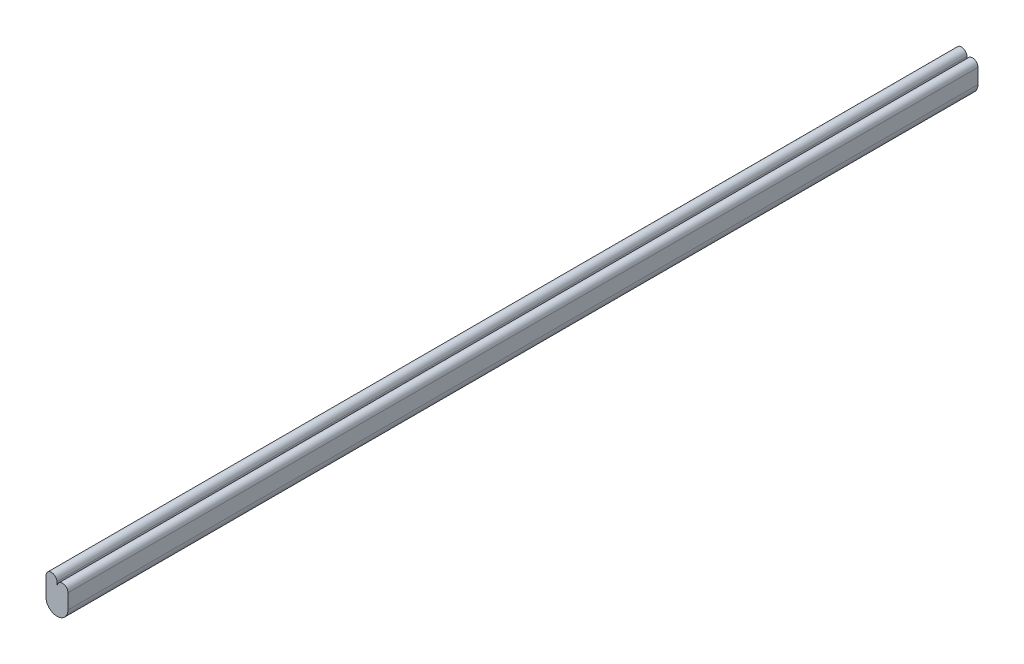
ISO-10303-21;
HEADER;
FILE_DESCRIPTION(('STEP AP214'),'2;1');
FILE_NAME('part.step','',(''),(''),'','','');
FILE_SCHEMA(('AUTOMOTIVE_DESIGN { 1 0 10303 214 1 1 1 1 }'));
ENDSEC;
DATA;
#1=APPLICATION_CONTEXT('core data for automotive mechanical design processes');
#2=APPLICATION_PROTOCOL_DEFINITION('international standard','automotive_design',2000,#1);
#3=PRODUCT_CONTEXT('',#1,'mechanical');
#4=PRODUCT('Part','Part','',(#3));
#5=PRODUCT_RELATED_PRODUCT_CATEGORY('part','',(#4));
#6=PRODUCT_DEFINITION_FORMATION('','',#4);
#7=PRODUCT_DEFINITION_CONTEXT('part definition',#1,'design');
#8=PRODUCT_DEFINITION('design','',#6,#7);
#9=PRODUCT_DEFINITION_SHAPE('','',#8);
#10=(LENGTH_UNIT() NAMED_UNIT(*) SI_UNIT(.MILLI.,.METRE.));
#11=(NAMED_UNIT(*) PLANE_ANGLE_UNIT() SI_UNIT($,.RADIAN.));
#12=(NAMED_UNIT(*) SI_UNIT($,.STERADIAN.) SOLID_ANGLE_UNIT());
#13=UNCERTAINTY_MEASURE_WITH_UNIT(LENGTH_MEASURE(1.E-05),#10,'distance_accuracy_value','');
#14=(GEOMETRIC_REPRESENTATION_CONTEXT(3) GLOBAL_UNCERTAINTY_ASSIGNED_CONTEXT((#13)) GLOBAL_UNIT_ASSIGNED_CONTEXT((#10,
#11,#12)) REPRESENTATION_CONTEXT('',''));
#15=CARTESIAN_POINT('',(0.,0.,0.));
#16=DIRECTION('',(0.,0.,1.));
#17=DIRECTION('',(1.,0.,0.));
#18=AXIS2_PLACEMENT_3D('',#15,#16,#17);
#19=CARTESIAN_POINT('',(-3.5250000148788,12.0249999553636,580.));
#20=DIRECTION('',(0.,0.,-1.));
#21=DIRECTION('',(-1.,0.,0.));
#22=AXIS2_PLACEMENT_3D('',#19,#20,#21);
#23=CYLINDRICAL_SURFACE('',#22,3.4750000148788);
#24=CARTESIAN_POINT('',(-3.5250000148788,12.0249999553636,0.));
#25=DIRECTION('',(0.,0.,1.));
#26=DIRECTION('',(1.,0.,0.));
#27=AXIS2_PLACEMENT_3D('',#24,#25,#26);
#28=CIRCLE('',#27,3.4750000148788);
#29=CARTESIAN_POINT('',(-0.0499999999999997,12.0249999553636,0.));
#30=VERTEX_POINT('',#29);
#31=CARTESIAN_POINT('',(-7.00000002975761,12.0249999553636,0.));
#32=VERTEX_POINT('',#31);
#33=EDGE_CURVE('E133',#30,#32,#28,.T.);
#34=ORIENTED_EDGE('',*,*,#33,.T.);
#35=DIRECTION('',(0.,0.,-1.));
#36=VECTOR('',#35,1.);
#37=CARTESIAN_POINT('',(-7.00000002975761,12.0249999553636,580.));
#38=LINE('',#37,#36);
#39=CARTESIAN_POINT('',(-7.00000002975761,12.0249999553636,580.));
#40=VERTEX_POINT('',#39);
#41=EDGE_CURVE('E11',#40,#32,#38,.T.);
#42=ORIENTED_EDGE('',*,*,#41,.F.);
#43=CARTESIAN_POINT('',(-3.5250000148788,12.0249999553636,580.));
#44=DIRECTION('',(0.,0.,1.));
#45=DIRECTION('',(1.,0.,0.));
#46=AXIS2_PLACEMENT_3D('',#43,#44,#45);
#47=CIRCLE('',#46,3.4750000148788);
#48=CARTESIAN_POINT('',(-0.0499999999999997,12.0249999553636,580.));
#49=VERTEX_POINT('',#48);
#50=EDGE_CURVE('E151',#49,#40,#47,.T.);
#51=ORIENTED_EDGE('',*,*,#50,.F.);
#52=DIRECTION('',(0.,0.,-1.));
#53=VECTOR('',#52,1.);
#54=CARTESIAN_POINT('',(-0.0499999999999997,12.0249999553636,580.));
#55=LINE('',#54,#53);
#56=EDGE_CURVE('E51',#49,#30,#55,.T.);
#57=ORIENTED_EDGE('',*,*,#56,.T.);
#58=EDGE_LOOP('',(#34,#42,#51,#57));
#59=FACE_BOUND('',#58,.T.);
#60=ADVANCED_FACE('F35',(#59),#23,.T.);
#61=CARTESIAN_POINT('',(-7.00000002975761,12.0249999553636,580.));
#62=DIRECTION('',(1.,0.,0.));
#63=DIRECTION('',(0.,0.,-1.));
#64=AXIS2_PLACEMENT_3D('',#61,#62,#63);
#65=PLANE('',#64);
#66=DIRECTION('',(0.,-1.,0.));
#67=VECTOR('',#66,1.);
#68=CARTESIAN_POINT('',(-7.00000002975761,12.0249999553636,0.));
#69=LINE('',#68,#67);
#70=CARTESIAN_POINT('',(-7.00000002975761,0.,0.));
#71=VERTEX_POINT('',#70);
#72=EDGE_CURVE('E135',#32,#71,#69,.T.);
#73=ORIENTED_EDGE('',*,*,#72,.T.);
#74=DIRECTION('',(0.,0.,-1.));
#75=VECTOR('',#74,1.);
#76=CARTESIAN_POINT('',(-7.00000002975761,0.,580.));
#77=LINE('',#76,#75);
#78=CARTESIAN_POINT('',(-7.00000002975761,0.,580.));
#79=VERTEX_POINT('',#78);
#80=EDGE_CURVE('E43',#79,#71,#77,.T.);
#81=ORIENTED_EDGE('',*,*,#80,.F.);
#82=DIRECTION('',(0.,-1.,0.));
#83=VECTOR('',#82,1.);
#84=CARTESIAN_POINT('',(-7.00000002975761,12.0249999553636,580.));
#85=LINE('',#84,#83);
#86=EDGE_CURVE('E90',#40,#79,#85,.T.);
#87=ORIENTED_EDGE('',*,*,#86,.F.);
#88=ORIENTED_EDGE('',*,*,#41,.T.);
#89=EDGE_LOOP('',(#73,#81,#87,#88));
#90=FACE_BOUND('',#89,.T.);
#91=ADVANCED_FACE('F178',(#90),#65,.F.);
#92=CARTESIAN_POINT('',(0.,0.,580.));
#93=DIRECTION('',(0.,0.,-1.));
#94=DIRECTION('',(-1.,0.,0.));
#95=AXIS2_PLACEMENT_3D('',#92,#93,#94);
#96=CYLINDRICAL_SURFACE('',#95,7.00000002975761);
#97=CARTESIAN_POINT('',(0.,0.,0.));
#98=DIRECTION('',(0.,0.,1.));
#99=DIRECTION('',(1.,0.,0.));
#100=AXIS2_PLACEMENT_3D('',#97,#98,#99);
#101=CIRCLE('',#100,7.00000002975761);
#102=CARTESIAN_POINT('',(7.00000002975761,0.,0.));
#103=VERTEX_POINT('',#102);
#104=EDGE_CURVE('E137',#71,#103,#101,.T.);
#105=ORIENTED_EDGE('',*,*,#104,.T.);
#106=DIRECTION('',(0.,0.,-1.));
#107=VECTOR('',#106,1.);
#108=CARTESIAN_POINT('',(7.00000002975761,0.,580.));
#109=LINE('',#108,#107);
#110=CARTESIAN_POINT('',(7.00000002975761,0.,580.));
#111=VERTEX_POINT('',#110);
#112=EDGE_CURVE('E157',#111,#103,#109,.T.);
#113=ORIENTED_EDGE('',*,*,#112,.F.);
#114=CARTESIAN_POINT('',(0.,0.,580.));
#115=DIRECTION('',(0.,0.,1.));
#116=DIRECTION('',(1.,0.,0.));
#117=AXIS2_PLACEMENT_3D('',#114,#115,#116);
#118=CIRCLE('',#117,7.00000002975761);
#119=EDGE_CURVE('E165',#79,#111,#118,.T.);
#120=ORIENTED_EDGE('',*,*,#119,.F.);
#121=ORIENTED_EDGE('',*,*,#80,.T.);
#122=EDGE_LOOP('',(#105,#113,#120,#121));
#123=FACE_BOUND('',#122,.T.);
#124=ADVANCED_FACE('F163',(#123),#96,.T.);
#125=CARTESIAN_POINT('',(7.00000002975761,0.,580.));
#126=DIRECTION('',(-1.,0.,0.));
#127=DIRECTION('',(0.,0.,1.));
#128=AXIS2_PLACEMENT_3D('',#125,#126,#127);
#129=PLANE('',#128);
#130=DIRECTION('',(0.,1.,0.));
#131=VECTOR('',#130,1.);
#132=CARTESIAN_POINT('',(7.00000002975761,0.,0.));
#133=LINE('',#132,#131);
#134=CARTESIAN_POINT('',(7.00000002975761,9.52499995536359,0.));
#135=VERTEX_POINT('',#134);
#136=EDGE_CURVE('E139',#103,#135,#133,.T.);
#137=ORIENTED_EDGE('',*,*,#136,.T.);
#138=DIRECTION('',(0.,0.,-1.));
#139=VECTOR('',#138,1.);
#140=CARTESIAN_POINT('',(7.00000002975761,9.52499995536359,580.));
#141=LINE('',#140,#139);
#142=CARTESIAN_POINT('',(7.00000002975761,9.52499995536359,580.));
#143=VERTEX_POINT('',#142);
#144=EDGE_CURVE('E155',#143,#135,#141,.T.);
#145=ORIENTED_EDGE('',*,*,#144,.F.);
#146=DIRECTION('',(0.,1.,0.));
#147=VECTOR('',#146,1.);
#148=CARTESIAN_POINT('',(7.00000002975761,0.,580.));
#149=LINE('',#148,#147);
#150=EDGE_CURVE('E128',#111,#143,#149,.T.);
#151=ORIENTED_EDGE('',*,*,#150,.F.);
#152=ORIENTED_EDGE('',*,*,#112,.T.);
#153=EDGE_LOOP('',(#137,#145,#151,#152));
#154=FACE_BOUND('',#153,.T.);
#155=ADVANCED_FACE('F172',(#154),#129,.F.);
#156=CARTESIAN_POINT('',(3.5250000148788,9.52499995536359,580.));
#157=DIRECTION('',(0.,0.,-1.));
#158=DIRECTION('',(-1.,0.,0.));
#159=AXIS2_PLACEMENT_3D('',#156,#157,#158);
#160=CYLINDRICAL_SURFACE('',#159,3.4750000148788);
#161=CARTESIAN_POINT('',(3.5250000148788,9.52499995536359,0.));
#162=DIRECTION('',(0.,0.,-1.));
#163=DIRECTION('',(-1.,0.,0.));
#164=AXIS2_PLACEMENT_3D('',#161,#162,#163);
#165=CIRCLE('',#164,3.4750000148788);
#166=CARTESIAN_POINT('',(0.0500000000000001,9.52499995536359,0.));
#167=VERTEX_POINT('',#166);
#168=EDGE_CURVE('E142',#167,#135,#165,.T.);
#169=ORIENTED_EDGE('',*,*,#168,.F.);
#170=DIRECTION('',(0.,0.,-1.));
#171=VECTOR('',#170,1.);
#172=CARTESIAN_POINT('',(0.0500000000000001,9.52499995536359,580.));
#173=LINE('',#172,#171);
#174=CARTESIAN_POINT('',(0.0500000000000001,9.52499995536359,580.));
#175=VERTEX_POINT('',#174);
#176=EDGE_CURVE('E115',#175,#167,#173,.T.);
#177=ORIENTED_EDGE('',*,*,#176,.F.);
#178=CARTESIAN_POINT('',(3.5250000148788,9.52499995536359,580.));
#179=DIRECTION('',(0.,0.,-1.));
#180=DIRECTION('',(-1.,0.,0.));
#181=AXIS2_PLACEMENT_3D('',#178,#179,#180);
#182=CIRCLE('',#181,3.4750000148788);
#183=EDGE_CURVE('E126',#175,#143,#182,.T.);
#184=ORIENTED_EDGE('',*,*,#183,.T.);
#185=ORIENTED_EDGE('',*,*,#144,.T.);
#186=EDGE_LOOP('',(#169,#177,#184,#185));
#187=FACE_BOUND('',#186,.T.);
#188=ADVANCED_FACE('F188',(#187),#160,.T.);
#189=CARTESIAN_POINT('',(0.05,0.,580.));
#190=DIRECTION('',(-1.,0.,0.));
#191=DIRECTION('',(0.,-1.,0.));
#192=AXIS2_PLACEMENT_3D('',#189,#190,#191);
#193=PLANE('',#192);
#194=DIRECTION('',(0.,1.,0.));
#195=VECTOR('',#194,1.);
#196=CARTESIAN_POINT('',(0.05,0.,0.));
#197=LINE('',#196,#195);
#198=CARTESIAN_POINT('',(0.05,0.,0.));
#199=VERTEX_POINT('',#198);
#200=EDGE_CURVE('E112',#199,#167,#197,.T.);
#201=ORIENTED_EDGE('',*,*,#200,.F.);
#202=DIRECTION('',(0.,0.,-1.));
#203=VECTOR('',#202,1.);
#204=CARTESIAN_POINT('',(0.05,0.,580.));
#205=LINE('',#204,#203);
#206=CARTESIAN_POINT('',(0.05,0.,580.));
#207=VERTEX_POINT('',#206);
#208=EDGE_CURVE('E106',#207,#199,#205,.T.);
#209=ORIENTED_EDGE('',*,*,#208,.F.);
#210=DIRECTION('',(0.,1.,0.));
#211=VECTOR('',#210,1.);
#212=CARTESIAN_POINT('',(0.05,0.,580.));
#213=LINE('',#212,#211);
#214=EDGE_CURVE('E110',#207,#175,#213,.T.);
#215=ORIENTED_EDGE('',*,*,#214,.T.);
#216=ORIENTED_EDGE('',*,*,#176,.T.);
#217=EDGE_LOOP('',(#201,#209,#215,#216));
#218=FACE_BOUND('',#217,.T.);
#219=ADVANCED_FACE('F108',(#218),#193,.T.);
#220=CARTESIAN_POINT('',(0.,0.,580.));
#221=DIRECTION('',(0.,0.,-1.));
#222=DIRECTION('',(-1.,0.,0.));
#223=AXIS2_PLACEMENT_3D('',#220,#221,#222);
#224=CYLINDRICAL_SURFACE('',#223,0.05);
#225=CARTESIAN_POINT('',(0.,0.,0.));
#226=DIRECTION('',(0.,0.,-1.));
#227=DIRECTION('',(-1.,0.,0.));
#228=AXIS2_PLACEMENT_3D('',#225,#226,#227);
#229=CIRCLE('',#228,0.05);
#230=CARTESIAN_POINT('',(-0.05,0.,0.));
#231=VERTEX_POINT('',#230);
#232=EDGE_CURVE('E146',#199,#231,#229,.T.);
#233=ORIENTED_EDGE('',*,*,#232,.T.);
#234=DIRECTION('',(0.,0.,-1.));
#235=VECTOR('',#234,1.);
#236=CARTESIAN_POINT('',(-0.05,0.,580.));
#237=LINE('',#236,#235);
#238=CARTESIAN_POINT('',(-0.05,0.,580.));
#239=VERTEX_POINT('',#238);
#240=EDGE_CURVE('E78',#239,#231,#237,.T.);
#241=ORIENTED_EDGE('',*,*,#240,.F.);
#242=CARTESIAN_POINT('',(0.,0.,580.));
#243=DIRECTION('',(0.,0.,-1.));
#244=DIRECTION('',(-1.,0.,0.));
#245=AXIS2_PLACEMENT_3D('',#242,#243,#244);
#246=CIRCLE('',#245,0.05);
#247=EDGE_CURVE('E117',#207,#239,#246,.T.);
#248=ORIENTED_EDGE('',*,*,#247,.F.);
#249=ORIENTED_EDGE('',*,*,#208,.T.);
#250=EDGE_LOOP('',(#233,#241,#248,#249));
#251=FACE_BOUND('',#250,.T.);
#252=ADVANCED_FACE('F118',(#251),#224,.F.);
#253=CARTESIAN_POINT('',(-0.0499999999999997,12.0249999553636,580.));
#254=DIRECTION('',(1.,0.,0.));
#255=DIRECTION('',(0.,1.,0.));
#256=AXIS2_PLACEMENT_3D('',#253,#254,#255);
#257=PLANE('',#256);
#258=DIRECTION('',(0.,-1.,0.));
#259=VECTOR('',#258,1.);
#260=CARTESIAN_POINT('',(-0.0499999999999997,12.0249999553636,0.));
#261=LINE('',#260,#259);
#262=EDGE_CURVE('E148',#30,#231,#261,.T.);
#263=ORIENTED_EDGE('',*,*,#262,.F.);
#264=ORIENTED_EDGE('',*,*,#56,.F.);
#265=DIRECTION('',(0.,-1.,0.));
#266=VECTOR('',#265,1.);
#267=CARTESIAN_POINT('',(-0.0499999999999997,12.0249999553636,580.));
#268=LINE('',#267,#266);
#269=EDGE_CURVE('E121',#49,#239,#268,.T.);
#270=ORIENTED_EDGE('',*,*,#269,.T.);
#271=ORIENTED_EDGE('',*,*,#240,.T.);
#272=EDGE_LOOP('',(#263,#264,#270,#271));
#273=FACE_BOUND('',#272,.T.);
#274=ADVANCED_FACE('F196',(#273),#257,.T.);
#275=CARTESIAN_POINT('',(-3.5250000148788,12.0249999553636,580.));
#276=DIRECTION('',(0.,0.,1.));
#277=DIRECTION('',(1.,0.,0.));
#278=AXIS2_PLACEMENT_3D('',#275,#276,#277);
#279=PLANE('',#278);
#280=ORIENTED_EDGE('',*,*,#50,.T.);
#281=ORIENTED_EDGE('',*,*,#86,.T.);
#282=ORIENTED_EDGE('',*,*,#119,.T.);
#283=ORIENTED_EDGE('',*,*,#150,.T.);
#284=ORIENTED_EDGE('',*,*,#183,.F.);
#285=ORIENTED_EDGE('',*,*,#214,.F.);
#286=ORIENTED_EDGE('',*,*,#247,.T.);
#287=ORIENTED_EDGE('',*,*,#269,.F.);
#288=EDGE_LOOP('',(#280,#281,#282,#283,#284,#285,#286,#287));
#289=FACE_BOUND('',#288,.T.);
#290=ADVANCED_FACE('F124',(#289),#279,.T.);
#291=CARTESIAN_POINT('',(-3.5250000148788,12.0249999553636,0.));
#292=DIRECTION('',(0.,0.,1.));
#293=DIRECTION('',(1.,0.,0.));
#294=AXIS2_PLACEMENT_3D('',#291,#292,#293);
#295=PLANE('',#294);
#296=ORIENTED_EDGE('',*,*,#33,.F.);
#297=ORIENTED_EDGE('',*,*,#262,.T.);
#298=ORIENTED_EDGE('',*,*,#232,.F.);
#299=ORIENTED_EDGE('',*,*,#200,.T.);
#300=ORIENTED_EDGE('',*,*,#168,.T.);
#301=ORIENTED_EDGE('',*,*,#136,.F.);
#302=ORIENTED_EDGE('',*,*,#104,.F.);
#303=ORIENTED_EDGE('',*,*,#72,.F.);
#304=EDGE_LOOP('',(#296,#297,#298,#299,#300,#301,#302,#303));
#305=FACE_BOUND('',#304,.T.);
#306=ADVANCED_FACE('F168',(#305),#295,.F.);
#307=CLOSED_SHELL('',(#60,#91,#124,#155,#188,#219,#252,#274,#290,#306));
#308=MANIFOLD_SOLID_BREP('B2',#307);
#309=ADVANCED_BREP_SHAPE_REPRESENTATION('',(#18,#308),#14);
#310=SHAPE_DEFINITION_REPRESENTATION(#9,#309);
ENDSEC;
END-ISO-10303-21;
